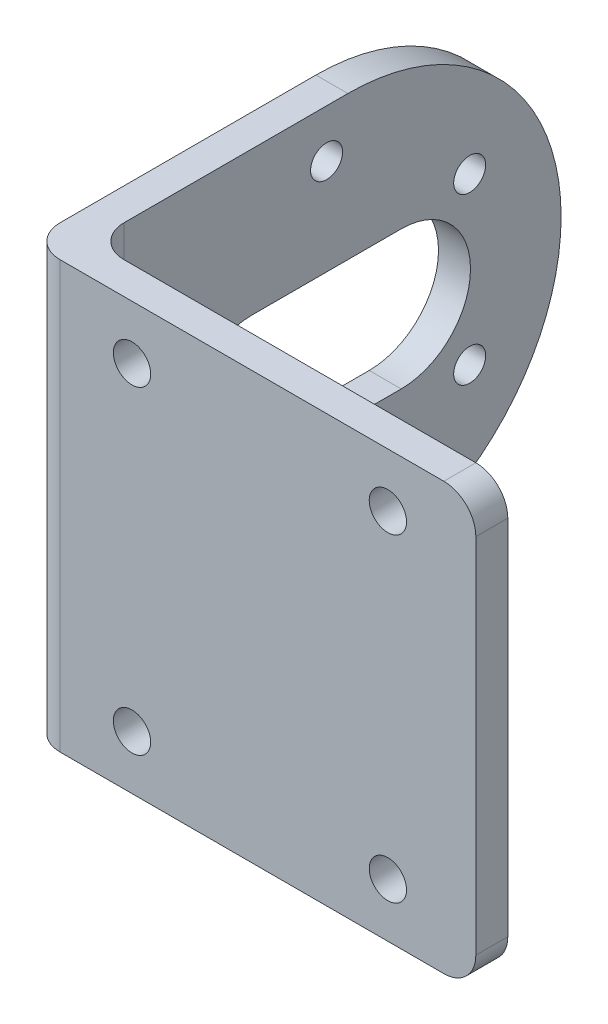
ISO-10303-21;
HEADER;
FILE_DESCRIPTION(('STEP AP214'),'2;1');
FILE_NAME('part.step','',(''),(''),'','','');
FILE_SCHEMA(('AUTOMOTIVE_DESIGN { 1 0 10303 214 1 1 1 1 }'));
ENDSEC;
DATA;
#1=APPLICATION_CONTEXT('core data for automotive mechanical design processes');
#2=APPLICATION_PROTOCOL_DEFINITION('international standard','automotive_design',2000,#1);
#3=PRODUCT_CONTEXT('',#1,'mechanical');
#4=PRODUCT('Part','Part','',(#3));
#5=PRODUCT_RELATED_PRODUCT_CATEGORY('part','',(#4));
#6=PRODUCT_DEFINITION_FORMATION('','',#4);
#7=PRODUCT_DEFINITION_CONTEXT('part definition',#1,'design');
#8=PRODUCT_DEFINITION('design','',#6,#7);
#9=PRODUCT_DEFINITION_SHAPE('','',#8);
#10=(LENGTH_UNIT() NAMED_UNIT(*) SI_UNIT(.MILLI.,.METRE.));
#11=(NAMED_UNIT(*) PLANE_ANGLE_UNIT() SI_UNIT($,.RADIAN.));
#12=(NAMED_UNIT(*) SI_UNIT($,.STERADIAN.) SOLID_ANGLE_UNIT());
#13=UNCERTAINTY_MEASURE_WITH_UNIT(LENGTH_MEASURE(1.E-05),#10,'distance_accuracy_value','');
#14=(GEOMETRIC_REPRESENTATION_CONTEXT(3) GLOBAL_UNCERTAINTY_ASSIGNED_CONTEXT((#13)) GLOBAL_UNIT_ASSIGNED_CONTEXT((#10,
#11,#12)) REPRESENTATION_CONTEXT('',''));
#15=CARTESIAN_POINT('',(0.,0.,0.));
#16=DIRECTION('',(0.,0.,1.));
#17=DIRECTION('',(1.,0.,0.));
#18=AXIS2_PLACEMENT_3D('',#15,#16,#17);
#19=CARTESIAN_POINT('',(0.,40.,0.));
#20=DIRECTION('',(0.,0.,-1.));
#21=DIRECTION('',(-1.,0.,0.));
#22=AXIS2_PLACEMENT_3D('',#19,#20,#21);
#23=PLANE('',#22);
#24=CARTESIAN_POINT('',(33.75,5.05,0.));
#25=DIRECTION('',(0.,0.,-1.));
#26=DIRECTION('',(1.,0.,0.));
#27=AXIS2_PLACEMENT_3D('',#24,#25,#26);
#28=CIRCLE('',#27,1.75);
#29=CARTESIAN_POINT('',(35.5,5.05,0.));
#30=VERTEX_POINT('',#29);
#31=EDGE_CURVE('E514',#30,#30,#28,.T.);
#32=ORIENTED_EDGE('',*,*,#31,.T.);
#33=EDGE_LOOP('',(#32));
#34=FACE_BOUND('',#33,.T.);
#35=CARTESIAN_POINT('',(9.75,5.05,0.));
#36=DIRECTION('',(0.,0.,-1.));
#37=DIRECTION('',(1.,0.,0.));
#38=AXIS2_PLACEMENT_3D('',#35,#36,#37);
#39=CIRCLE('',#38,1.75);
#40=CARTESIAN_POINT('',(11.5,5.05,0.));
#41=VERTEX_POINT('',#40);
#42=EDGE_CURVE('E501',#41,#41,#39,.T.);
#43=ORIENTED_EDGE('',*,*,#42,.T.);
#44=EDGE_LOOP('',(#43));
#45=FACE_BOUND('',#44,.T.);
#46=CARTESIAN_POINT('',(9.75,34.95,0.));
#47=DIRECTION('',(0.,0.,-1.));
#48=DIRECTION('',(-1.,0.,0.));
#49=AXIS2_PLACEMENT_3D('',#46,#47,#48);
#50=CIRCLE('',#49,1.75);
#51=CARTESIAN_POINT('',(8.,34.95,0.));
#52=VERTEX_POINT('',#51);
#53=EDGE_CURVE('E495',#52,#52,#50,.T.);
#54=ORIENTED_EDGE('',*,*,#53,.T.);
#55=EDGE_LOOP('',(#54));
#56=FACE_BOUND('',#55,.T.);
#57=CARTESIAN_POINT('',(33.75,34.95,0.));
#58=DIRECTION('',(0.,0.,-1.));
#59=DIRECTION('',(-1.,0.,0.));
#60=AXIS2_PLACEMENT_3D('',#57,#58,#59);
#61=CIRCLE('',#60,1.75);
#62=CARTESIAN_POINT('',(32.,34.95,0.));
#63=VERTEX_POINT('',#62);
#64=EDGE_CURVE('E338',#63,#63,#61,.T.);
#65=ORIENTED_EDGE('',*,*,#64,.T.);
#66=EDGE_LOOP('',(#65));
#67=FACE_BOUND('',#66,.T.);
#68=DIRECTION('',(1.,0.,0.));
#69=VECTOR('',#68,1.);
#70=CARTESIAN_POINT('',(0.,0.,0.));
#71=LINE('',#70,#69);
#72=CARTESIAN_POINT('',(3.,0.,0.));
#73=VERTEX_POINT('',#72);
#74=CARTESIAN_POINT('',(39.,0.,0.));
#75=VERTEX_POINT('',#74);
#76=EDGE_CURVE('E265',#73,#75,#71,.T.);
#77=ORIENTED_EDGE('',*,*,#76,.T.);
#78=CARTESIAN_POINT('',(39.,3.,0.));
#79=DIRECTION('',(0.,0.,-1.));
#80=DIRECTION('',(-1.,0.,0.));
#81=AXIS2_PLACEMENT_3D('',#78,#79,#80);
#82=CIRCLE('',#81,3.);
#83=CARTESIAN_POINT('',(42.,3.,0.));
#84=VERTEX_POINT('',#83);
#85=EDGE_CURVE('E48',#75,#84,#82,.F.);
#86=ORIENTED_EDGE('',*,*,#85,.T.);
#87=DIRECTION('',(0.,-1.,0.));
#88=VECTOR('',#87,1.);
#89=CARTESIAN_POINT('',(42.,40.,0.));
#90=LINE('',#89,#88);
#91=CARTESIAN_POINT('',(42.,37.,0.));
#92=VERTEX_POINT('',#91);
#93=EDGE_CURVE('E281',#92,#84,#90,.T.);
#94=ORIENTED_EDGE('',*,*,#93,.F.);
#95=CARTESIAN_POINT('',(39.,37.,0.));
#96=DIRECTION('',(0.,0.,-1.));
#97=DIRECTION('',(-1.,0.,0.));
#98=AXIS2_PLACEMENT_3D('',#95,#96,#97);
#99=CIRCLE('',#98,3.);
#100=CARTESIAN_POINT('',(39.,40.,0.));
#101=VERTEX_POINT('',#100);
#102=EDGE_CURVE('E55',#92,#101,#99,.F.);
#103=ORIENTED_EDGE('',*,*,#102,.T.);
#104=DIRECTION('',(1.,0.,0.));
#105=VECTOR('',#104,1.);
#106=CARTESIAN_POINT('',(0.,40.,0.));
#107=LINE('',#106,#105);
#108=CARTESIAN_POINT('',(3.,40.,0.));
#109=VERTEX_POINT('',#108);
#110=EDGE_CURVE('E250',#109,#101,#107,.T.);
#111=ORIENTED_EDGE('',*,*,#110,.F.);
#112=DIRECTION('',(0.,-1.,0.));
#113=VECTOR('',#112,1.);
#114=CARTESIAN_POINT('',(3.,40.,0.));
#115=LINE('',#114,#113);
#116=EDGE_CURVE('E285',#109,#73,#115,.T.);
#117=ORIENTED_EDGE('',*,*,#116,.T.);
#118=EDGE_LOOP('',(#77,#86,#94,#103,#111,#117));
#119=FACE_BOUND('',#118,.T.);
#120=ADVANCED_FACE('F39',(#34,#45,#56,#67,#119),#23,.F.);
#121=CARTESIAN_POINT('',(42.,40.,-3.));
#122=DIRECTION('',(-1.,0.,0.));
#123=DIRECTION('',(0.,0.,1.));
#124=AXIS2_PLACEMENT_3D('',#121,#122,#123);
#125=PLANE('',#124);
#126=ORIENTED_EDGE('',*,*,#93,.T.);
#127=DIRECTION('',(0.,0.,-1.));
#128=VECTOR('',#127,1.);
#129=CARTESIAN_POINT('',(42.,3.,-3.));
#130=LINE('',#129,#128);
#131=CARTESIAN_POINT('',(42.,3.,-3.));
#132=VERTEX_POINT('',#131);
#133=EDGE_CURVE('E341',#84,#132,#130,.T.);
#134=ORIENTED_EDGE('',*,*,#133,.T.);
#135=DIRECTION('',(0.,-1.,0.));
#136=VECTOR('',#135,1.);
#137=CARTESIAN_POINT('',(42.,40.,-3.));
#138=LINE('',#137,#136);
#139=CARTESIAN_POINT('',(42.,37.,-3.));
#140=VERTEX_POINT('',#139);
#141=EDGE_CURVE('E264',#140,#132,#138,.T.);
#142=ORIENTED_EDGE('',*,*,#141,.F.);
#143=DIRECTION('',(0.,0.,-1.));
#144=VECTOR('',#143,1.);
#145=CARTESIAN_POINT('',(42.,37.,-3.));
#146=LINE('',#145,#144);
#147=EDGE_CURVE('E334',#140,#92,#146,.F.);
#148=ORIENTED_EDGE('',*,*,#147,.T.);
#149=EDGE_LOOP('',(#126,#134,#142,#148));
#150=FACE_BOUND('',#149,.T.);
#151=ADVANCED_FACE('F359',(#150),#125,.F.);
#152=CARTESIAN_POINT('',(3.,40.,-3.));
#153=DIRECTION('',(0.,0.,1.));
#154=DIRECTION('',(1.,0.,0.));
#155=AXIS2_PLACEMENT_3D('',#152,#153,#154);
#156=PLANE('',#155);
#157=CARTESIAN_POINT('',(33.75,5.05,-3.));
#158=DIRECTION('',(0.,0.,-1.));
#159=DIRECTION('',(1.,0.,0.));
#160=AXIS2_PLACEMENT_3D('',#157,#158,#159);
#161=CIRCLE('',#160,1.75);
#162=CARTESIAN_POINT('',(35.5,5.05,-3.));
#163=VERTEX_POINT('',#162);
#164=EDGE_CURVE('E517',#163,#163,#161,.T.);
#165=ORIENTED_EDGE('',*,*,#164,.F.);
#166=EDGE_LOOP('',(#165));
#167=FACE_BOUND('',#166,.T.);
#168=CARTESIAN_POINT('',(9.75,5.05,-3.));
#169=DIRECTION('',(0.,0.,-1.));
#170=DIRECTION('',(1.,0.,0.));
#171=AXIS2_PLACEMENT_3D('',#168,#169,#170);
#172=CIRCLE('',#171,1.75);
#173=CARTESIAN_POINT('',(11.5,5.05,-3.));
#174=VERTEX_POINT('',#173);
#175=EDGE_CURVE('E508',#174,#174,#172,.T.);
#176=ORIENTED_EDGE('',*,*,#175,.F.);
#177=EDGE_LOOP('',(#176));
#178=FACE_BOUND('',#177,.T.);
#179=CARTESIAN_POINT('',(9.75,34.95,-3.));
#180=DIRECTION('',(0.,0.,-1.));
#181=DIRECTION('',(-1.,0.,0.));
#182=AXIS2_PLACEMENT_3D('',#179,#180,#181);
#183=CIRCLE('',#182,1.75);
#184=CARTESIAN_POINT('',(8.,34.95,-3.));
#185=VERTEX_POINT('',#184);
#186=EDGE_CURVE('E498',#185,#185,#183,.T.);
#187=ORIENTED_EDGE('',*,*,#186,.F.);
#188=EDGE_LOOP('',(#187));
#189=FACE_BOUND('',#188,.T.);
#190=CARTESIAN_POINT('',(33.75,34.95,-3.));
#191=DIRECTION('',(0.,0.,-1.));
#192=DIRECTION('',(-1.,0.,0.));
#193=AXIS2_PLACEMENT_3D('',#190,#191,#192);
#194=CIRCLE('',#193,1.75);
#195=CARTESIAN_POINT('',(32.,34.95,-3.));
#196=VERTEX_POINT('',#195);
#197=EDGE_CURVE('E505',#196,#196,#194,.T.);
#198=ORIENTED_EDGE('',*,*,#197,.F.);
#199=EDGE_LOOP('',(#198));
#200=FACE_BOUND('',#199,.T.);
#201=ORIENTED_EDGE('',*,*,#141,.T.);
#202=CARTESIAN_POINT('',(39.,3.,-3.));
#203=DIRECTION('',(0.,0.,1.));
#204=DIRECTION('',(1.,0.,0.));
#205=AXIS2_PLACEMENT_3D('',#202,#203,#204);
#206=CIRCLE('',#205,3.);
#207=CARTESIAN_POINT('',(39.,0.,-3.));
#208=VERTEX_POINT('',#207);
#209=EDGE_CURVE('E348',#132,#208,#206,.F.);
#210=ORIENTED_EDGE('',*,*,#209,.T.);
#211=DIRECTION('',(-1.,0.,0.));
#212=VECTOR('',#211,1.);
#213=CARTESIAN_POINT('',(3.,0.,-3.));
#214=LINE('',#213,#212);
#215=CARTESIAN_POINT('',(6.,0.,-3.));
#216=VERTEX_POINT('',#215);
#217=EDGE_CURVE('E268',#208,#216,#214,.T.);
#218=ORIENTED_EDGE('',*,*,#217,.T.);
#219=DIRECTION('',(0.,-1.,0.));
#220=VECTOR('',#219,1.);
#221=CARTESIAN_POINT('',(6.,40.,-3.));
#222=LINE('',#221,#220);
#223=CARTESIAN_POINT('',(6.,40.,-3.));
#224=VERTEX_POINT('',#223);
#225=EDGE_CURVE('E304',#216,#224,#222,.F.);
#226=ORIENTED_EDGE('',*,*,#225,.T.);
#227=DIRECTION('',(-1.,0.,0.));
#228=VECTOR('',#227,1.);
#229=CARTESIAN_POINT('',(3.,40.,-3.));
#230=LINE('',#229,#228);
#231=CARTESIAN_POINT('',(39.,40.,-3.));
#232=VERTEX_POINT('',#231);
#233=EDGE_CURVE('E253',#232,#224,#230,.T.);
#234=ORIENTED_EDGE('',*,*,#233,.F.);
#235=CARTESIAN_POINT('',(39.,37.,-3.));
#236=DIRECTION('',(0.,0.,1.));
#237=DIRECTION('',(1.,0.,0.));
#238=AXIS2_PLACEMENT_3D('',#235,#236,#237);
#239=CIRCLE('',#238,3.);
#240=EDGE_CURVE('E345',#232,#140,#239,.F.);
#241=ORIENTED_EDGE('',*,*,#240,.T.);
#242=EDGE_LOOP('',(#201,#210,#218,#226,#234,#241));
#243=FACE_BOUND('',#242,.T.);
#244=ADVANCED_FACE('F364',(#167,#178,#189,#200,#243),#156,.F.);
#245=CARTESIAN_POINT('',(3.,40.,-3.));
#246=DIRECTION('',(-1.,0.,0.));
#247=DIRECTION('',(0.,0.,1.));
#248=AXIS2_PLACEMENT_3D('',#245,#246,#247);
#249=PLANE('',#248);
#250=CARTESIAN_POINT('',(3.,4.5,-25.));
#251=DIRECTION('',(1.,0.,0.));
#252=DIRECTION('',(0.,0.,-1.));
#253=AXIS2_PLACEMENT_3D('',#250,#251,#252);
#254=CIRCLE('',#253,1.5);
#255=CARTESIAN_POINT('',(3.,4.5,-26.5));
#256=VERTEX_POINT('',#255);
#257=EDGE_CURVE('E186',#256,#256,#254,.T.);
#258=ORIENTED_EDGE('',*,*,#257,.F.);
#259=EDGE_LOOP('',(#258));
#260=FACE_BOUND('',#259,.T.);
#261=CARTESIAN_POINT('',(3.,12.2499999999998,-38.4233937586587));
#262=DIRECTION('',(1.,0.,0.));
#263=DIRECTION('',(0.,0.,-1.));
#264=AXIS2_PLACEMENT_3D('',#261,#262,#263);
#265=CIRCLE('',#264,1.5);
#266=CARTESIAN_POINT('',(3.,12.2499999999998,-39.9233937586587));
#267=VERTEX_POINT('',#266);
#268=EDGE_CURVE('E205',#267,#267,#265,.T.);
#269=ORIENTED_EDGE('',*,*,#268,.F.);
#270=EDGE_LOOP('',(#269));
#271=FACE_BOUND('',#270,.T.);
#272=DIRECTION('',(0.,0.,-1.));
#273=VECTOR('',#272,1.);
#274=CARTESIAN_POINT('',(3.,13.5,-18.));
#275=LINE('',#274,#273);
#276=CARTESIAN_POINT('',(3.,13.5,-18.));
#277=VERTEX_POINT('',#276);
#278=CARTESIAN_POINT('',(3.,13.5,-32.));
#279=VERTEX_POINT('',#278);
#280=EDGE_CURVE('E195',#277,#279,#275,.T.);
#281=ORIENTED_EDGE('',*,*,#280,.F.);
#282=CARTESIAN_POINT('',(3.,20.,-18.));
#283=DIRECTION('',(1.,0.,0.));
#284=DIRECTION('',(0.,0.,-1.));
#285=AXIS2_PLACEMENT_3D('',#282,#283,#284);
#286=CIRCLE('',#285,6.5);
#287=CARTESIAN_POINT('',(3.,26.5,-18.));
#288=VERTEX_POINT('',#287);
#289=EDGE_CURVE('E158',#288,#277,#286,.T.);
#290=ORIENTED_EDGE('',*,*,#289,.F.);
#291=DIRECTION('',(0.,0.,1.));
#292=VECTOR('',#291,1.);
#293=CARTESIAN_POINT('',(3.,26.5,-18.));
#294=LINE('',#293,#292);
#295=CARTESIAN_POINT('',(3.,26.5,-32.));
#296=VERTEX_POINT('',#295);
#297=EDGE_CURVE('E179',#296,#288,#294,.T.);
#298=ORIENTED_EDGE('',*,*,#297,.F.);
#299=CARTESIAN_POINT('',(3.,20.,-32.));
#300=DIRECTION('',(1.,0.,0.));
#301=DIRECTION('',(0.,0.,-1.));
#302=AXIS2_PLACEMENT_3D('',#299,#300,#301);
#303=CIRCLE('',#302,6.5);
#304=EDGE_CURVE('E183',#279,#296,#303,.T.);
#305=ORIENTED_EDGE('',*,*,#304,.F.);
#306=EDGE_LOOP('',(#281,#290,#298,#305));
#307=FACE_BOUND('',#306,.T.);
#308=CARTESIAN_POINT('',(3.,27.7499999999999,-38.4233937586589));
#309=DIRECTION('',(1.,0.,0.));
#310=DIRECTION('',(0.,0.,-1.));
#311=AXIS2_PLACEMENT_3D('',#308,#309,#310);
#312=CIRCLE('',#311,1.5);
#313=CARTESIAN_POINT('',(3.,27.7499999999999,-39.9233937586589));
#314=VERTEX_POINT('',#313);
#315=EDGE_CURVE('E215',#314,#314,#312,.T.);
#316=ORIENTED_EDGE('',*,*,#315,.F.);
#317=EDGE_LOOP('',(#316));
#318=FACE_BOUND('',#317,.T.);
#319=CARTESIAN_POINT('',(3.,35.5,-25.0000000000001));
#320=DIRECTION('',(1.,0.,0.));
#321=DIRECTION('',(0.,0.,-1.));
#322=AXIS2_PLACEMENT_3D('',#319,#320,#321);
#323=CIRCLE('',#322,1.5);
#324=CARTESIAN_POINT('',(3.,35.5,-26.5000000000001));
#325=VERTEX_POINT('',#324);
#326=EDGE_CURVE('E239',#325,#325,#323,.T.);
#327=ORIENTED_EDGE('',*,*,#326,.F.);
#328=EDGE_LOOP('',(#327));
#329=FACE_BOUND('',#328,.T.);
#330=CARTESIAN_POINT('',(3.,27.7500000000001,-11.5766062413412));
#331=DIRECTION('',(1.,0.,0.));
#332=DIRECTION('',(0.,0.,-1.));
#333=AXIS2_PLACEMENT_3D('',#330,#331,#332);
#334=CIRCLE('',#333,1.5);
#335=CARTESIAN_POINT('',(3.,27.7500000000001,-13.0766062413412));
#336=VERTEX_POINT('',#335);
#337=EDGE_CURVE('E231',#336,#336,#334,.T.);
#338=ORIENTED_EDGE('',*,*,#337,.F.);
#339=EDGE_LOOP('',(#338));
#340=FACE_BOUND('',#339,.T.);
#341=CARTESIAN_POINT('',(3.,12.25,-11.5766062413412));
#342=DIRECTION('',(1.,0.,0.));
#343=DIRECTION('',(0.,0.,-1.));
#344=AXIS2_PLACEMENT_3D('',#341,#342,#343);
#345=CIRCLE('',#344,1.5);
#346=CARTESIAN_POINT('',(3.,12.25,-13.0766062413412));
#347=VERTEX_POINT('',#346);
#348=EDGE_CURVE('E223',#347,#347,#345,.T.);
#349=ORIENTED_EDGE('',*,*,#348,.F.);
#350=EDGE_LOOP('',(#349));
#351=FACE_BOUND('',#350,.T.);
#352=DIRECTION('',(0.,0.,-1.));
#353=VECTOR('',#352,1.);
#354=CARTESIAN_POINT('',(3.,0.,-3.));
#355=LINE('',#354,#353);
#356=CARTESIAN_POINT('',(3.,0.,-6.));
#357=VERTEX_POINT('',#356);
#358=CARTESIAN_POINT('',(3.,0.,-27.));
#359=VERTEX_POINT('',#358);
#360=EDGE_CURVE('E272',#357,#359,#355,.T.);
#361=ORIENTED_EDGE('',*,*,#360,.T.);
#362=CARTESIAN_POINT('',(3.,20.,-27.));
#363=DIRECTION('',(-1.,0.,0.));
#364=DIRECTION('',(0.,0.,1.));
#365=AXIS2_PLACEMENT_3D('',#362,#363,#364);
#366=CIRCLE('',#365,20.);
#367=CARTESIAN_POINT('',(3.,20.,-47.));
#368=VERTEX_POINT('',#367);
#369=EDGE_CURVE('E328',#359,#368,#366,.F.);
#370=ORIENTED_EDGE('',*,*,#369,.T.);
#371=CARTESIAN_POINT('',(3.,20.,-27.));
#372=DIRECTION('',(-1.,0.,0.));
#373=DIRECTION('',(0.,0.,1.));
#374=AXIS2_PLACEMENT_3D('',#371,#372,#373);
#375=CIRCLE('',#374,20.);
#376=CARTESIAN_POINT('',(3.,40.,-27.));
#377=VERTEX_POINT('',#376);
#378=EDGE_CURVE('E325',#368,#377,#375,.F.);
#379=ORIENTED_EDGE('',*,*,#378,.T.);
#380=DIRECTION('',(0.,0.,-1.));
#381=VECTOR('',#380,1.);
#382=CARTESIAN_POINT('',(3.,40.,-3.));
#383=LINE('',#382,#381);
#384=CARTESIAN_POINT('',(3.,40.,-6.));
#385=VERTEX_POINT('',#384);
#386=EDGE_CURVE('E257',#385,#377,#383,.T.);
#387=ORIENTED_EDGE('',*,*,#386,.F.);
#388=DIRECTION('',(0.,-1.,0.));
#389=VECTOR('',#388,1.);
#390=CARTESIAN_POINT('',(3.,0.,-6.));
#391=LINE('',#390,#389);
#392=EDGE_CURVE('E300',#385,#357,#391,.T.);
#393=ORIENTED_EDGE('',*,*,#392,.T.);
#394=EDGE_LOOP('',(#361,#370,#379,#387,#393));
#395=FACE_BOUND('',#394,.T.);
#396=ADVANCED_FACE('F424',(#260,#271,#307,#318,#329,#340,#351,#395),#249,.F.);
#397=CARTESIAN_POINT('',(0.,40.,0.));
#398=DIRECTION('',(1.,0.,0.));
#399=DIRECTION('',(0.,0.,-1.));
#400=AXIS2_PLACEMENT_3D('',#397,#398,#399);
#401=PLANE('',#400);
#402=CARTESIAN_POINT('',(0.,4.5,-25.));
#403=DIRECTION('',(1.,0.,0.));
#404=DIRECTION('',(0.,0.,-1.));
#405=AXIS2_PLACEMENT_3D('',#402,#403,#404);
#406=CIRCLE('',#405,1.5);
#407=CARTESIAN_POINT('',(0.,4.5,-26.5));
#408=VERTEX_POINT('',#407);
#409=EDGE_CURVE('E269',#408,#408,#406,.T.);
#410=ORIENTED_EDGE('',*,*,#409,.T.);
#411=EDGE_LOOP('',(#410));
#412=FACE_BOUND('',#411,.T.);
#413=CARTESIAN_POINT('',(0.,12.2499999999998,-38.4233937586587));
#414=DIRECTION('',(1.,0.,0.));
#415=DIRECTION('',(0.,0.,-1.));
#416=AXIS2_PLACEMENT_3D('',#413,#414,#415);
#417=CIRCLE('',#416,1.5);
#418=CARTESIAN_POINT('',(0.,12.2499999999998,-39.9233937586587));
#419=VERTEX_POINT('',#418);
#420=EDGE_CURVE('E211',#419,#419,#417,.T.);
#421=ORIENTED_EDGE('',*,*,#420,.T.);
#422=EDGE_LOOP('',(#421));
#423=FACE_BOUND('',#422,.T.);
#424=DIRECTION('',(0.,0.,1.));
#425=VECTOR('',#424,1.);
#426=CARTESIAN_POINT('',(0.,26.5,-18.));
#427=LINE('',#426,#425);
#428=CARTESIAN_POINT('',(0.,26.5,-32.));
#429=VERTEX_POINT('',#428);
#430=CARTESIAN_POINT('',(0.,26.5,-18.));
#431=VERTEX_POINT('',#430);
#432=EDGE_CURVE('E164',#429,#431,#427,.T.);
#433=ORIENTED_EDGE('',*,*,#432,.T.);
#434=CARTESIAN_POINT('',(0.,20.,-18.));
#435=DIRECTION('',(1.,0.,0.));
#436=DIRECTION('',(0.,0.,-1.));
#437=AXIS2_PLACEMENT_3D('',#434,#435,#436);
#438=CIRCLE('',#437,6.5);
#439=CARTESIAN_POINT('',(0.,13.5,-18.));
#440=VERTEX_POINT('',#439);
#441=EDGE_CURVE('E155',#431,#440,#438,.T.);
#442=ORIENTED_EDGE('',*,*,#441,.T.);
#443=DIRECTION('',(0.,0.,-1.));
#444=VECTOR('',#443,1.);
#445=CARTESIAN_POINT('',(0.,13.5,-18.));
#446=LINE('',#445,#444);
#447=CARTESIAN_POINT('',(0.,13.5,-32.));
#448=VERTEX_POINT('',#447);
#449=EDGE_CURVE('E168',#440,#448,#446,.T.);
#450=ORIENTED_EDGE('',*,*,#449,.T.);
#451=CARTESIAN_POINT('',(0.,20.,-32.));
#452=DIRECTION('',(1.,0.,0.));
#453=DIRECTION('',(0.,0.,-1.));
#454=AXIS2_PLACEMENT_3D('',#451,#452,#453);
#455=CIRCLE('',#454,6.5);
#456=EDGE_CURVE('E173',#448,#429,#455,.T.);
#457=ORIENTED_EDGE('',*,*,#456,.T.);
#458=EDGE_LOOP('',(#433,#442,#450,#457));
#459=FACE_BOUND('',#458,.T.);
#460=CARTESIAN_POINT('',(0.,27.7499999999999,-38.4233937586589));
#461=DIRECTION('',(1.,0.,0.));
#462=DIRECTION('',(0.,0.,-1.));
#463=AXIS2_PLACEMENT_3D('',#460,#461,#462);
#464=CIRCLE('',#463,1.5);
#465=CARTESIAN_POINT('',(0.,27.7499999999999,-39.9233937586589));
#466=VERTEX_POINT('',#465);
#467=EDGE_CURVE('E243',#466,#466,#464,.T.);
#468=ORIENTED_EDGE('',*,*,#467,.T.);
#469=EDGE_LOOP('',(#468));
#470=FACE_BOUND('',#469,.T.);
#471=CARTESIAN_POINT('',(0.,35.5,-25.0000000000001));
#472=DIRECTION('',(1.,0.,0.));
#473=DIRECTION('',(0.,0.,-1.));
#474=AXIS2_PLACEMENT_3D('',#471,#472,#473);
#475=CIRCLE('',#474,1.5);
#476=CARTESIAN_POINT('',(0.,35.5,-26.5000000000001));
#477=VERTEX_POINT('',#476);
#478=EDGE_CURVE('E235',#477,#477,#475,.T.);
#479=ORIENTED_EDGE('',*,*,#478,.T.);
#480=EDGE_LOOP('',(#479));
#481=FACE_BOUND('',#480,.T.);
#482=CARTESIAN_POINT('',(0.,27.7500000000001,-11.5766062413412));
#483=DIRECTION('',(1.,0.,0.));
#484=DIRECTION('',(0.,0.,-1.));
#485=AXIS2_PLACEMENT_3D('',#482,#483,#484);
#486=CIRCLE('',#485,1.5);
#487=CARTESIAN_POINT('',(0.,27.7500000000001,-13.0766062413412));
#488=VERTEX_POINT('',#487);
#489=EDGE_CURVE('E227',#488,#488,#486,.T.);
#490=ORIENTED_EDGE('',*,*,#489,.T.);
#491=EDGE_LOOP('',(#490));
#492=FACE_BOUND('',#491,.T.);
#493=CARTESIAN_POINT('',(0.,12.25,-11.5766062413412));
#494=DIRECTION('',(1.,0.,0.));
#495=DIRECTION('',(0.,0.,-1.));
#496=AXIS2_PLACEMENT_3D('',#493,#494,#495);
#497=CIRCLE('',#496,1.5);
#498=CARTESIAN_POINT('',(0.,12.25,-13.0766062413412));
#499=VERTEX_POINT('',#498);
#500=EDGE_CURVE('E219',#499,#499,#497,.T.);
#501=ORIENTED_EDGE('',*,*,#500,.T.);
#502=EDGE_LOOP('',(#501));
#503=FACE_BOUND('',#502,.T.);
#504=CARTESIAN_POINT('',(0.,20.,-27.));
#505=DIRECTION('',(1.,0.,0.));
#506=DIRECTION('',(0.,0.,-1.));
#507=AXIS2_PLACEMENT_3D('',#504,#505,#506);
#508=CIRCLE('',#507,20.);
#509=CARTESIAN_POINT('',(0.,40.,-27.));
#510=VERTEX_POINT('',#509);
#511=CARTESIAN_POINT('',(0.,20.,-47.));
#512=VERTEX_POINT('',#511);
#513=EDGE_CURVE('E315',#510,#512,#508,.F.);
#514=ORIENTED_EDGE('',*,*,#513,.T.);
#515=CARTESIAN_POINT('',(0.,20.,-27.));
#516=DIRECTION('',(1.,0.,0.));
#517=DIRECTION('',(0.,0.,-1.));
#518=AXIS2_PLACEMENT_3D('',#515,#516,#517);
#519=CIRCLE('',#518,20.);
#520=CARTESIAN_POINT('',(0.,0.,-27.));
#521=VERTEX_POINT('',#520);
#522=EDGE_CURVE('E318',#512,#521,#519,.F.);
#523=ORIENTED_EDGE('',*,*,#522,.T.);
#524=DIRECTION('',(0.,0.,1.));
#525=VECTOR('',#524,1.);
#526=CARTESIAN_POINT('',(0.,0.,0.));
#527=LINE('',#526,#525);
#528=CARTESIAN_POINT('',(0.,0.,-3.));
#529=VERTEX_POINT('',#528);
#530=EDGE_CURVE('E254',#521,#529,#527,.T.);
#531=ORIENTED_EDGE('',*,*,#530,.T.);
#532=DIRECTION('',(0.,-1.,0.));
#533=VECTOR('',#532,1.);
#534=CARTESIAN_POINT('',(0.,40.,-3.));
#535=LINE('',#534,#533);
#536=CARTESIAN_POINT('',(0.,40.,-3.));
#537=VERTEX_POINT('',#536);
#538=EDGE_CURVE('E293',#529,#537,#535,.F.);
#539=ORIENTED_EDGE('',*,*,#538,.T.);
#540=DIRECTION('',(0.,0.,1.));
#541=VECTOR('',#540,1.);
#542=CARTESIAN_POINT('',(0.,40.,0.));
#543=LINE('',#542,#541);
#544=EDGE_CURVE('E261',#510,#537,#543,.T.);
#545=ORIENTED_EDGE('',*,*,#544,.F.);
#546=EDGE_LOOP('',(#514,#523,#531,#539,#545));
#547=FACE_BOUND('',#546,.T.);
#548=ADVANCED_FACE('F175',(#412,#423,#459,#470,#481,#492,#503,#547),#401,.F.);
#549=CARTESIAN_POINT('',(0.,40.,0.));
#550=DIRECTION('',(0.,-1.,0.));
#551=DIRECTION('',(0.,0.,-1.));
#552=AXIS2_PLACEMENT_3D('',#549,#550,#551);
#553=PLANE('',#552);
#554=ORIENTED_EDGE('',*,*,#110,.T.);
#555=DIRECTION('',(0.,0.,-1.));
#556=VECTOR('',#555,1.);
#557=CARTESIAN_POINT('',(39.,40.,0.));
#558=LINE('',#557,#556);
#559=EDGE_CURVE('E11',#101,#232,#558,.T.);
#560=ORIENTED_EDGE('',*,*,#559,.T.);
#561=ORIENTED_EDGE('',*,*,#233,.T.);
#562=CARTESIAN_POINT('',(6.,40.,-6.));
#563=DIRECTION('',(0.,-1.,0.));
#564=DIRECTION('',(0.,0.,-1.));
#565=AXIS2_PLACEMENT_3D('',#562,#563,#564);
#566=CIRCLE('',#565,3.);
#567=EDGE_CURVE('E312',#224,#385,#566,.T.);
#568=ORIENTED_EDGE('',*,*,#567,.T.);
#569=ORIENTED_EDGE('',*,*,#386,.T.);
#570=DIRECTION('',(-1.,0.,0.));
#571=VECTOR('',#570,1.);
#572=CARTESIAN_POINT('',(0.,40.,-27.));
#573=LINE('',#572,#571);
#574=EDGE_CURVE('E331',#377,#510,#573,.T.);
#575=ORIENTED_EDGE('',*,*,#574,.T.);
#576=ORIENTED_EDGE('',*,*,#544,.T.);
#577=CARTESIAN_POINT('',(3.,40.,-3.));
#578=DIRECTION('',(0.,-1.,0.));
#579=DIRECTION('',(0.,0.,-1.));
#580=AXIS2_PLACEMENT_3D('',#577,#578,#579);
#581=CIRCLE('',#580,3.);
#582=EDGE_CURVE('E297',#537,#109,#581,.F.);
#583=ORIENTED_EDGE('',*,*,#582,.T.);
#584=EDGE_LOOP('',(#554,#560,#561,#568,#569,#575,#576,#583));
#585=FACE_BOUND('',#584,.T.);
#586=ADVANCED_FACE('F374',(#585),#553,.F.);
#587=CARTESIAN_POINT('',(0.,0.,0.));
#588=DIRECTION('',(0.,-1.,0.));
#589=DIRECTION('',(0.,0.,-1.));
#590=AXIS2_PLACEMENT_3D('',#587,#588,#589);
#591=PLANE('',#590);
#592=ORIENTED_EDGE('',*,*,#217,.F.);
#593=DIRECTION('',(0.,0.,-1.));
#594=VECTOR('',#593,1.);
#595=CARTESIAN_POINT('',(39.,0.,0.));
#596=LINE('',#595,#594);
#597=EDGE_CURVE('E63',#208,#75,#596,.F.);
#598=ORIENTED_EDGE('',*,*,#597,.T.);
#599=ORIENTED_EDGE('',*,*,#76,.F.);
#600=CARTESIAN_POINT('',(3.,0.,-3.));
#601=DIRECTION('',(0.,-1.,0.));
#602=DIRECTION('',(0.,0.,-1.));
#603=AXIS2_PLACEMENT_3D('',#600,#601,#602);
#604=CIRCLE('',#603,3.);
#605=EDGE_CURVE('E289',#73,#529,#604,.T.);
#606=ORIENTED_EDGE('',*,*,#605,.T.);
#607=ORIENTED_EDGE('',*,*,#530,.F.);
#608=DIRECTION('',(-1.,0.,0.));
#609=VECTOR('',#608,1.);
#610=CARTESIAN_POINT('',(3.,0.,-27.));
#611=LINE('',#610,#609);
#612=EDGE_CURVE('E321',#521,#359,#611,.F.);
#613=ORIENTED_EDGE('',*,*,#612,.T.);
#614=ORIENTED_EDGE('',*,*,#360,.F.);
#615=CARTESIAN_POINT('',(6.,0.,-6.));
#616=DIRECTION('',(0.,-1.,0.));
#617=DIRECTION('',(0.,0.,-1.));
#618=AXIS2_PLACEMENT_3D('',#615,#616,#617);
#619=CIRCLE('',#618,3.);
#620=EDGE_CURVE('E308',#357,#216,#619,.F.);
#621=ORIENTED_EDGE('',*,*,#620,.T.);
#622=EDGE_LOOP('',(#592,#598,#599,#606,#607,#613,#614,#621));
#623=FACE_BOUND('',#622,.T.);
#624=ADVANCED_FACE('F365',(#623),#591,.T.);
#625=CARTESIAN_POINT('',(0.,12.25,-11.5766062413412));
#626=DIRECTION('',(1.,0.,0.));
#627=DIRECTION('',(0.,0.,-1.));
#628=AXIS2_PLACEMENT_3D('',#625,#626,#627);
#629=CYLINDRICAL_SURFACE('',#628,1.5);
#630=ORIENTED_EDGE('',*,*,#500,.F.);
#631=EDGE_LOOP('',(#630));
#632=FACE_BOUND('',#631,.T.);
#633=ORIENTED_EDGE('',*,*,#348,.T.);
#634=EDGE_LOOP('',(#633));
#635=FACE_BOUND('',#634,.T.);
#636=ADVANCED_FACE('F440',(#632,#635),#629,.F.);
#637=CARTESIAN_POINT('',(0.,27.7500000000001,-11.5766062413412));
#638=DIRECTION('',(1.,0.,0.));
#639=DIRECTION('',(0.,0.,-1.));
#640=AXIS2_PLACEMENT_3D('',#637,#638,#639);
#641=CYLINDRICAL_SURFACE('',#640,1.5);
#642=ORIENTED_EDGE('',*,*,#489,.F.);
#643=EDGE_LOOP('',(#642));
#644=FACE_BOUND('',#643,.T.);
#645=ORIENTED_EDGE('',*,*,#337,.T.);
#646=EDGE_LOOP('',(#645));
#647=FACE_BOUND('',#646,.T.);
#648=ADVANCED_FACE('F450',(#644,#647),#641,.F.);
#649=CARTESIAN_POINT('',(0.,35.5,-25.0000000000001));
#650=DIRECTION('',(1.,0.,0.));
#651=DIRECTION('',(0.,0.,-1.));
#652=AXIS2_PLACEMENT_3D('',#649,#650,#651);
#653=CYLINDRICAL_SURFACE('',#652,1.5);
#654=ORIENTED_EDGE('',*,*,#478,.F.);
#655=EDGE_LOOP('',(#654));
#656=FACE_BOUND('',#655,.T.);
#657=ORIENTED_EDGE('',*,*,#326,.T.);
#658=EDGE_LOOP('',(#657));
#659=FACE_BOUND('',#658,.T.);
#660=ADVANCED_FACE('F446',(#656,#659),#653,.F.);
#661=CARTESIAN_POINT('',(0.,27.7499999999999,-38.4233937586589));
#662=DIRECTION('',(1.,0.,0.));
#663=DIRECTION('',(0.,0.,-1.));
#664=AXIS2_PLACEMENT_3D('',#661,#662,#663);
#665=CYLINDRICAL_SURFACE('',#664,1.5);
#666=ORIENTED_EDGE('',*,*,#467,.F.);
#667=EDGE_LOOP('',(#666));
#668=FACE_BOUND('',#667,.T.);
#669=ORIENTED_EDGE('',*,*,#315,.T.);
#670=EDGE_LOOP('',(#669));
#671=FACE_BOUND('',#670,.T.);
#672=ADVANCED_FACE('F443',(#668,#671),#665,.F.);
#673=CARTESIAN_POINT('',(0.,20.,-18.));
#674=DIRECTION('',(1.,0.,0.));
#675=DIRECTION('',(0.,0.,-1.));
#676=AXIS2_PLACEMENT_3D('',#673,#674,#675);
#677=CYLINDRICAL_SURFACE('',#676,6.5);
#678=ORIENTED_EDGE('',*,*,#289,.T.);
#679=DIRECTION('',(1.,0.,0.));
#680=VECTOR('',#679,1.);
#681=CARTESIAN_POINT('',(0.,13.5,-18.));
#682=LINE('',#681,#680);
#683=EDGE_CURVE('E151',#440,#277,#682,.T.);
#684=ORIENTED_EDGE('',*,*,#683,.F.);
#685=ORIENTED_EDGE('',*,*,#441,.F.);
#686=DIRECTION('',(1.,0.,0.));
#687=VECTOR('',#686,1.);
#688=CARTESIAN_POINT('',(0.,26.5,-18.));
#689=LINE('',#688,#687);
#690=EDGE_CURVE('E202',#431,#288,#689,.T.);
#691=ORIENTED_EDGE('',*,*,#690,.T.);
#692=EDGE_LOOP('',(#678,#684,#685,#691));
#693=FACE_BOUND('',#692,.T.);
#694=ADVANCED_FACE('F153',(#693),#677,.F.);
#695=CARTESIAN_POINT('',(0.,26.5,-18.));
#696=DIRECTION('',(0.,1.,0.));
#697=DIRECTION('',(0.,0.,1.));
#698=AXIS2_PLACEMENT_3D('',#695,#696,#697);
#699=PLANE('',#698);
#700=ORIENTED_EDGE('',*,*,#297,.T.);
#701=ORIENTED_EDGE('',*,*,#690,.F.);
#702=ORIENTED_EDGE('',*,*,#432,.F.);
#703=DIRECTION('',(1.,0.,0.));
#704=VECTOR('',#703,1.);
#705=CARTESIAN_POINT('',(0.,26.5,-32.));
#706=LINE('',#705,#704);
#707=EDGE_CURVE('E206',#429,#296,#706,.T.);
#708=ORIENTED_EDGE('',*,*,#707,.T.);
#709=EDGE_LOOP('',(#700,#701,#702,#708));
#710=FACE_BOUND('',#709,.T.);
#711=ADVANCED_FACE('F464',(#710),#699,.F.);
#712=CARTESIAN_POINT('',(0.,20.,-32.));
#713=DIRECTION('',(1.,0.,0.));
#714=DIRECTION('',(0.,0.,-1.));
#715=AXIS2_PLACEMENT_3D('',#712,#713,#714);
#716=CYLINDRICAL_SURFACE('',#715,6.5);
#717=ORIENTED_EDGE('',*,*,#304,.T.);
#718=ORIENTED_EDGE('',*,*,#707,.F.);
#719=ORIENTED_EDGE('',*,*,#456,.F.);
#720=DIRECTION('',(1.,0.,0.));
#721=VECTOR('',#720,1.);
#722=CARTESIAN_POINT('',(0.,13.5,-32.));
#723=LINE('',#722,#721);
#724=EDGE_CURVE('E163',#448,#279,#723,.T.);
#725=ORIENTED_EDGE('',*,*,#724,.T.);
#726=EDGE_LOOP('',(#717,#718,#719,#725));
#727=FACE_BOUND('',#726,.T.);
#728=ADVANCED_FACE('F467',(#727),#716,.F.);
#729=CARTESIAN_POINT('',(0.,13.5,-18.));
#730=DIRECTION('',(0.,-1.,0.));
#731=DIRECTION('',(0.,0.,-1.));
#732=AXIS2_PLACEMENT_3D('',#729,#730,#731);
#733=PLANE('',#732);
#734=ORIENTED_EDGE('',*,*,#280,.T.);
#735=ORIENTED_EDGE('',*,*,#724,.F.);
#736=ORIENTED_EDGE('',*,*,#449,.F.);
#737=ORIENTED_EDGE('',*,*,#683,.T.);
#738=EDGE_LOOP('',(#734,#735,#736,#737));
#739=FACE_BOUND('',#738,.T.);
#740=ADVANCED_FACE('F169',(#739),#733,.F.);
#741=CARTESIAN_POINT('',(0.,12.2499999999998,-38.4233937586587));
#742=DIRECTION('',(1.,0.,0.));
#743=DIRECTION('',(0.,0.,-1.));
#744=AXIS2_PLACEMENT_3D('',#741,#742,#743);
#745=CYLINDRICAL_SURFACE('',#744,1.5);
#746=ORIENTED_EDGE('',*,*,#420,.F.);
#747=EDGE_LOOP('',(#746));
#748=FACE_BOUND('',#747,.T.);
#749=ORIENTED_EDGE('',*,*,#268,.T.);
#750=EDGE_LOOP('',(#749));
#751=FACE_BOUND('',#750,.T.);
#752=ADVANCED_FACE('F458',(#748,#751),#745,.F.);
#753=CARTESIAN_POINT('',(0.,4.5,-25.));
#754=DIRECTION('',(1.,0.,0.));
#755=DIRECTION('',(0.,0.,-1.));
#756=AXIS2_PLACEMENT_3D('',#753,#754,#755);
#757=CYLINDRICAL_SURFACE('',#756,1.5);
#758=ORIENTED_EDGE('',*,*,#409,.F.);
#759=EDGE_LOOP('',(#758));
#760=FACE_BOUND('',#759,.T.);
#761=ORIENTED_EDGE('',*,*,#257,.T.);
#762=EDGE_LOOP('',(#761));
#763=FACE_BOUND('',#762,.T.);
#764=ADVANCED_FACE('F397',(#760,#763),#757,.F.);
#765=CARTESIAN_POINT('',(3.,40.,-3.));
#766=DIRECTION('',(0.,-1.,0.));
#767=DIRECTION('',(0.,0.,-1.));
#768=AXIS2_PLACEMENT_3D('',#765,#766,#767);
#769=CYLINDRICAL_SURFACE('',#768,3.);
#770=ORIENTED_EDGE('',*,*,#582,.F.);
#771=ORIENTED_EDGE('',*,*,#538,.F.);
#772=ORIENTED_EDGE('',*,*,#605,.F.);
#773=ORIENTED_EDGE('',*,*,#116,.F.);
#774=EDGE_LOOP('',(#770,#771,#772,#773));
#775=FACE_BOUND('',#774,.T.);
#776=ADVANCED_FACE('F394',(#775),#769,.T.);
#777=CARTESIAN_POINT('',(6.,40.,-6.));
#778=DIRECTION('',(0.,1.,0.));
#779=DIRECTION('',(0.,0.,1.));
#780=AXIS2_PLACEMENT_3D('',#777,#778,#779);
#781=CYLINDRICAL_SURFACE('',#780,3.);
#782=ORIENTED_EDGE('',*,*,#567,.F.);
#783=ORIENTED_EDGE('',*,*,#225,.F.);
#784=ORIENTED_EDGE('',*,*,#620,.F.);
#785=ORIENTED_EDGE('',*,*,#392,.F.);
#786=EDGE_LOOP('',(#782,#783,#784,#785));
#787=FACE_BOUND('',#786,.T.);
#788=ADVANCED_FACE('F371',(#787),#781,.F.);
#789=CARTESIAN_POINT('',(0.,20.,-27.));
#790=DIRECTION('',(-1.,0.,0.));
#791=DIRECTION('',(0.,0.,1.));
#792=AXIS2_PLACEMENT_3D('',#789,#790,#791);
#793=CYLINDRICAL_SURFACE('',#792,20.);
#794=ORIENTED_EDGE('',*,*,#574,.F.);
#795=ORIENTED_EDGE('',*,*,#378,.F.);
#796=DIRECTION('',(-1.,0.,0.));
#797=VECTOR('',#796,1.);
#798=CARTESIAN_POINT('',(0.,20.,-47.));
#799=LINE('',#798,#797);
#800=EDGE_CURVE('E196',#512,#368,#799,.F.);
#801=ORIENTED_EDGE('',*,*,#800,.F.);
#802=ORIENTED_EDGE('',*,*,#513,.F.);
#803=EDGE_LOOP('',(#794,#795,#801,#802));
#804=FACE_BOUND('',#803,.T.);
#805=ADVANCED_FACE('F401',(#804),#793,.T.);
#806=CARTESIAN_POINT('',(0.,20.,-27.));
#807=DIRECTION('',(1.,0.,0.));
#808=DIRECTION('',(0.,0.,-1.));
#809=AXIS2_PLACEMENT_3D('',#806,#807,#808);
#810=CYLINDRICAL_SURFACE('',#809,20.);
#811=ORIENTED_EDGE('',*,*,#369,.F.);
#812=ORIENTED_EDGE('',*,*,#612,.F.);
#813=ORIENTED_EDGE('',*,*,#522,.F.);
#814=ORIENTED_EDGE('',*,*,#800,.T.);
#815=EDGE_LOOP('',(#811,#812,#813,#814));
#816=FACE_BOUND('',#815,.T.);
#817=ADVANCED_FACE('F402',(#816),#810,.T.);
#818=CARTESIAN_POINT('',(33.75,34.95,0.));
#819=DIRECTION('',(0.,0.,-1.));
#820=DIRECTION('',(-1.,0.,0.));
#821=AXIS2_PLACEMENT_3D('',#818,#819,#820);
#822=CYLINDRICAL_SURFACE('',#821,1.75);
#823=ORIENTED_EDGE('',*,*,#64,.F.);
#824=EDGE_LOOP('',(#823));
#825=FACE_BOUND('',#824,.T.);
#826=ORIENTED_EDGE('',*,*,#197,.T.);
#827=EDGE_LOOP('',(#826));
#828=FACE_BOUND('',#827,.T.);
#829=ADVANCED_FACE('F405',(#825,#828),#822,.F.);
#830=CARTESIAN_POINT('',(9.75,34.95,0.));
#831=DIRECTION('',(0.,0.,-1.));
#832=DIRECTION('',(-1.,0.,0.));
#833=AXIS2_PLACEMENT_3D('',#830,#831,#832);
#834=CYLINDRICAL_SURFACE('',#833,1.75);
#835=ORIENTED_EDGE('',*,*,#53,.F.);
#836=EDGE_LOOP('',(#835));
#837=FACE_BOUND('',#836,.T.);
#838=ORIENTED_EDGE('',*,*,#186,.T.);
#839=EDGE_LOOP('',(#838));
#840=FACE_BOUND('',#839,.T.);
#841=ADVANCED_FACE('F479',(#837,#840),#834,.F.);
#842=CARTESIAN_POINT('',(9.75,5.05,0.));
#843=DIRECTION('',(0.,0.,-1.));
#844=DIRECTION('',(-1.,0.,0.));
#845=AXIS2_PLACEMENT_3D('',#842,#843,#844);
#846=CYLINDRICAL_SURFACE('',#845,1.75);
#847=ORIENTED_EDGE('',*,*,#42,.F.);
#848=EDGE_LOOP('',(#847));
#849=FACE_BOUND('',#848,.T.);
#850=ORIENTED_EDGE('',*,*,#175,.T.);
#851=EDGE_LOOP('',(#850));
#852=FACE_BOUND('',#851,.T.);
#853=ADVANCED_FACE('F483',(#849,#852),#846,.F.);
#854=CARTESIAN_POINT('',(33.75,5.05,0.));
#855=DIRECTION('',(0.,0.,-1.));
#856=DIRECTION('',(-1.,0.,0.));
#857=AXIS2_PLACEMENT_3D('',#854,#855,#856);
#858=CYLINDRICAL_SURFACE('',#857,1.75);
#859=ORIENTED_EDGE('',*,*,#31,.F.);
#860=EDGE_LOOP('',(#859));
#861=FACE_BOUND('',#860,.T.);
#862=ORIENTED_EDGE('',*,*,#164,.T.);
#863=EDGE_LOOP('',(#862));
#864=FACE_BOUND('',#863,.T.);
#865=ADVANCED_FACE('F382',(#861,#864),#858,.F.);
#866=CARTESIAN_POINT('',(39.,3.,-3.));
#867=DIRECTION('',(0.,0.,1.));
#868=DIRECTION('',(1.,0.,0.));
#869=AXIS2_PLACEMENT_3D('',#866,#867,#868);
#870=CYLINDRICAL_SURFACE('',#869,3.);
#871=ORIENTED_EDGE('',*,*,#85,.F.);
#872=ORIENTED_EDGE('',*,*,#597,.F.);
#873=ORIENTED_EDGE('',*,*,#209,.F.);
#874=ORIENTED_EDGE('',*,*,#133,.F.);
#875=EDGE_LOOP('',(#871,#872,#873,#874));
#876=FACE_BOUND('',#875,.T.);
#877=ADVANCED_FACE('F362',(#876),#870,.T.);
#878=CARTESIAN_POINT('',(39.,37.,0.));
#879=DIRECTION('',(0.,0.,-1.));
#880=DIRECTION('',(-1.,0.,0.));
#881=AXIS2_PLACEMENT_3D('',#878,#879,#880);
#882=CYLINDRICAL_SURFACE('',#881,3.);
#883=ORIENTED_EDGE('',*,*,#102,.F.);
#884=ORIENTED_EDGE('',*,*,#147,.F.);
#885=ORIENTED_EDGE('',*,*,#240,.F.);
#886=ORIENTED_EDGE('',*,*,#559,.F.);
#887=EDGE_LOOP('',(#883,#884,#885,#886));
#888=FACE_BOUND('',#887,.T.);
#889=ADVANCED_FACE('F41',(#888),#882,.T.);
#890=CLOSED_SHELL('',(#120,#151,#244,#396,#548,#586,#624,#636,#648,#660,#672,#694,#711,#728,
#740,#752,#764,#776,#788,#805,#817,#829,#841,#853,#865,#877,#889));
#891=MANIFOLD_SOLID_BREP('B2',#890);
#892=ADVANCED_BREP_SHAPE_REPRESENTATION('',(#18,#891),#14);
#893=SHAPE_DEFINITION_REPRESENTATION(#9,#892);
ENDSEC;
END-ISO-10303-21;
